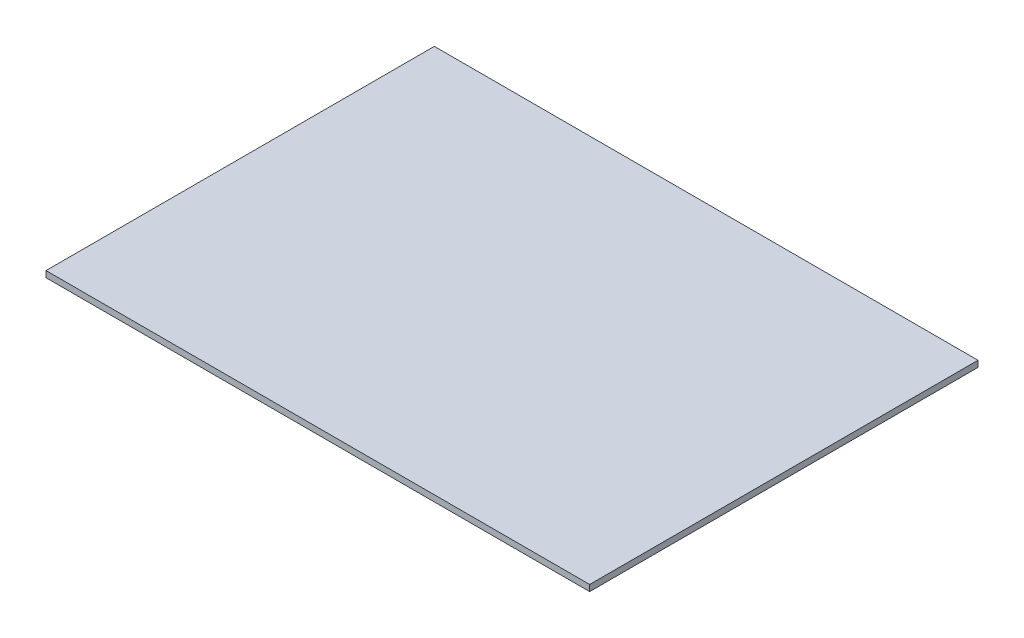
ISO-10303-21;
HEADER;
FILE_DESCRIPTION(('STEP AP214'),'2;1');
FILE_NAME('part.step','',(''),(''),'','','');
FILE_SCHEMA(('AUTOMOTIVE_DESIGN { 1 0 10303 214 1 1 1 1 }'));
ENDSEC;
DATA;
#1=APPLICATION_CONTEXT('core data for automotive mechanical design processes');
#2=APPLICATION_PROTOCOL_DEFINITION('international standard','automotive_design',2000,#1);
#3=PRODUCT_CONTEXT('',#1,'mechanical');
#4=PRODUCT('Part','Part','',(#3));
#5=PRODUCT_RELATED_PRODUCT_CATEGORY('part','',(#4));
#6=PRODUCT_DEFINITION_FORMATION('','',#4);
#7=PRODUCT_DEFINITION_CONTEXT('part definition',#1,'design');
#8=PRODUCT_DEFINITION('design','',#6,#7);
#9=PRODUCT_DEFINITION_SHAPE('','',#8);
#10=(LENGTH_UNIT() NAMED_UNIT(*) SI_UNIT(.MILLI.,.METRE.));
#11=(NAMED_UNIT(*) PLANE_ANGLE_UNIT() SI_UNIT($,.RADIAN.));
#12=(NAMED_UNIT(*) SI_UNIT($,.STERADIAN.) SOLID_ANGLE_UNIT());
#13=UNCERTAINTY_MEASURE_WITH_UNIT(LENGTH_MEASURE(1.E-05),#10,'distance_accuracy_value','');
#14=(GEOMETRIC_REPRESENTATION_CONTEXT(3) GLOBAL_UNCERTAINTY_ASSIGNED_CONTEXT((#13)) GLOBAL_UNIT_ASSIGNED_CONTEXT((#10,
#11,#12)) REPRESENTATION_CONTEXT('',''));
#15=CARTESIAN_POINT('',(0.,0.,0.));
#16=DIRECTION('',(0.,0.,1.));
#17=DIRECTION('',(1.,0.,0.));
#18=AXIS2_PLACEMENT_3D('',#15,#16,#17);
#19=CARTESIAN_POINT('',(-350.,8.,250.));
#20=DIRECTION('',(1.,0.,0.));
#21=DIRECTION('',(0.,0.,-1.));
#22=AXIS2_PLACEMENT_3D('',#19,#20,#21);
#23=PLANE('',#22);
#24=DIRECTION('',(0.,0.,1.));
#25=VECTOR('',#24,1.);
#26=CARTESIAN_POINT('',(-350.,0.,250.));
#27=LINE('',#26,#25);
#28=CARTESIAN_POINT('',(-350.,0.,-250.));
#29=VERTEX_POINT('',#28);
#30=CARTESIAN_POINT('',(-350.,0.,250.));
#31=VERTEX_POINT('',#30);
#32=EDGE_CURVE('E98',#29,#31,#27,.T.);
#33=ORIENTED_EDGE('',*,*,#32,.T.);
#34=DIRECTION('',(0.,-1.,0.));
#35=VECTOR('',#34,1.);
#36=CARTESIAN_POINT('',(-350.,8.,250.));
#37=LINE('',#36,#35);
#38=CARTESIAN_POINT('',(-350.,8.,250.));
#39=VERTEX_POINT('',#38);
#40=EDGE_CURVE('E11',#39,#31,#37,.T.);
#41=ORIENTED_EDGE('',*,*,#40,.F.);
#42=DIRECTION('',(0.,0.,1.));
#43=VECTOR('',#42,1.);
#44=CARTESIAN_POINT('',(-350.,8.,250.));
#45=LINE('',#44,#43);
#46=CARTESIAN_POINT('',(-350.,8.,-250.));
#47=VERTEX_POINT('',#46);
#48=EDGE_CURVE('E86',#47,#39,#45,.T.);
#49=ORIENTED_EDGE('',*,*,#48,.F.);
#50=DIRECTION('',(0.,-1.,0.));
#51=VECTOR('',#50,1.);
#52=CARTESIAN_POINT('',(-350.,8.,-250.));
#53=LINE('',#52,#51);
#54=EDGE_CURVE('E94',#47,#29,#53,.T.);
#55=ORIENTED_EDGE('',*,*,#54,.T.);
#56=EDGE_LOOP('',(#33,#41,#49,#55));
#57=FACE_BOUND('',#56,.T.);
#58=ADVANCED_FACE('F35',(#57),#23,.F.);
#59=CARTESIAN_POINT('',(350.,8.,250.));
#60=DIRECTION('',(0.,0.,-1.));
#61=DIRECTION('',(-1.,0.,0.));
#62=AXIS2_PLACEMENT_3D('',#59,#60,#61);
#63=PLANE('',#62);
#64=DIRECTION('',(1.,0.,0.));
#65=VECTOR('',#64,1.);
#66=CARTESIAN_POINT('',(350.,0.,250.));
#67=LINE('',#66,#65);
#68=CARTESIAN_POINT('',(350.,0.,250.));
#69=VERTEX_POINT('',#68);
#70=EDGE_CURVE('E90',#31,#69,#67,.T.);
#71=ORIENTED_EDGE('',*,*,#70,.T.);
#72=DIRECTION('',(0.,-1.,0.));
#73=VECTOR('',#72,1.);
#74=CARTESIAN_POINT('',(350.,8.,250.));
#75=LINE('',#74,#73);
#76=CARTESIAN_POINT('',(350.,8.,250.));
#77=VERTEX_POINT('',#76);
#78=EDGE_CURVE('E43',#77,#69,#75,.T.);
#79=ORIENTED_EDGE('',*,*,#78,.F.);
#80=DIRECTION('',(1.,0.,0.));
#81=VECTOR('',#80,1.);
#82=CARTESIAN_POINT('',(350.,8.,250.));
#83=LINE('',#82,#81);
#84=EDGE_CURVE('E81',#39,#77,#83,.T.);
#85=ORIENTED_EDGE('',*,*,#84,.F.);
#86=ORIENTED_EDGE('',*,*,#40,.T.);
#87=EDGE_LOOP('',(#71,#79,#85,#86));
#88=FACE_BOUND('',#87,.T.);
#89=ADVANCED_FACE('F89',(#88),#63,.F.);
#90=CARTESIAN_POINT('',(350.,8.,250.));
#91=DIRECTION('',(-1.,0.,0.));
#92=DIRECTION('',(0.,0.,1.));
#93=AXIS2_PLACEMENT_3D('',#90,#91,#92);
#94=PLANE('',#93);
#95=DIRECTION('',(0.,0.,-1.));
#96=VECTOR('',#95,1.);
#97=CARTESIAN_POINT('',(350.,0.,250.));
#98=LINE('',#97,#96);
#99=CARTESIAN_POINT('',(350.,0.,-250.));
#100=VERTEX_POINT('',#99);
#101=EDGE_CURVE('E68',#69,#100,#98,.T.);
#102=ORIENTED_EDGE('',*,*,#101,.T.);
#103=DIRECTION('',(0.,-1.,0.));
#104=VECTOR('',#103,1.);
#105=CARTESIAN_POINT('',(350.,8.,-250.));
#106=LINE('',#105,#104);
#107=CARTESIAN_POINT('',(350.,8.,-250.));
#108=VERTEX_POINT('',#107);
#109=EDGE_CURVE('E91',#108,#100,#106,.T.);
#110=ORIENTED_EDGE('',*,*,#109,.F.);
#111=DIRECTION('',(0.,0.,-1.));
#112=VECTOR('',#111,1.);
#113=CARTESIAN_POINT('',(350.,8.,250.));
#114=LINE('',#113,#112);
#115=EDGE_CURVE('E84',#77,#108,#114,.T.);
#116=ORIENTED_EDGE('',*,*,#115,.F.);
#117=ORIENTED_EDGE('',*,*,#78,.T.);
#118=EDGE_LOOP('',(#102,#110,#116,#117));
#119=FACE_BOUND('',#118,.T.);
#120=ADVANCED_FACE('F92',(#119),#94,.F.);
#121=CARTESIAN_POINT('',(350.,8.,-250.));
#122=DIRECTION('',(0.,0.,1.));
#123=DIRECTION('',(1.,0.,0.));
#124=AXIS2_PLACEMENT_3D('',#121,#122,#123);
#125=PLANE('',#124);
#126=DIRECTION('',(-1.,0.,0.));
#127=VECTOR('',#126,1.);
#128=CARTESIAN_POINT('',(350.,0.,-250.));
#129=LINE('',#128,#127);
#130=EDGE_CURVE('E74',#100,#29,#129,.T.);
#131=ORIENTED_EDGE('',*,*,#130,.T.);
#132=ORIENTED_EDGE('',*,*,#54,.F.);
#133=DIRECTION('',(-1.,0.,0.));
#134=VECTOR('',#133,1.);
#135=CARTESIAN_POINT('',(350.,8.,-250.));
#136=LINE('',#135,#134);
#137=EDGE_CURVE('E51',#108,#47,#136,.T.);
#138=ORIENTED_EDGE('',*,*,#137,.F.);
#139=ORIENTED_EDGE('',*,*,#109,.T.);
#140=EDGE_LOOP('',(#131,#132,#138,#139));
#141=FACE_BOUND('',#140,.T.);
#142=ADVANCED_FACE('F105',(#141),#125,.F.);
#143=CARTESIAN_POINT('',(0.,8.,0.));
#144=DIRECTION('',(0.,1.,0.));
#145=DIRECTION('',(0.,0.,1.));
#146=AXIS2_PLACEMENT_3D('',#143,#144,#145);
#147=PLANE('',#146);
#148=ORIENTED_EDGE('',*,*,#48,.T.);
#149=ORIENTED_EDGE('',*,*,#84,.T.);
#150=ORIENTED_EDGE('',*,*,#115,.T.);
#151=ORIENTED_EDGE('',*,*,#137,.T.);
#152=EDGE_LOOP('',(#148,#149,#150,#151));
#153=FACE_BOUND('',#152,.T.);
#154=ADVANCED_FACE('F82',(#153),#147,.T.);
#155=CARTESIAN_POINT('',(0.,0.,0.));
#156=DIRECTION('',(0.,1.,0.));
#157=DIRECTION('',(0.,0.,1.));
#158=AXIS2_PLACEMENT_3D('',#155,#156,#157);
#159=PLANE('',#158);
#160=ORIENTED_EDGE('',*,*,#32,.F.);
#161=ORIENTED_EDGE('',*,*,#130,.F.);
#162=ORIENTED_EDGE('',*,*,#101,.F.);
#163=ORIENTED_EDGE('',*,*,#70,.F.);
#164=EDGE_LOOP('',(#160,#161,#162,#163));
#165=FACE_BOUND('',#164,.T.);
#166=ADVANCED_FACE('F108',(#165),#159,.F.);
#167=CLOSED_SHELL('',(#58,#89,#120,#142,#154,#166));
#168=MANIFOLD_SOLID_BREP('B2',#167);
#169=ADVANCED_BREP_SHAPE_REPRESENTATION('',(#18,#168),#14);
#170=SHAPE_DEFINITION_REPRESENTATION(#9,#169);
ENDSEC;
END-ISO-10303-21;
